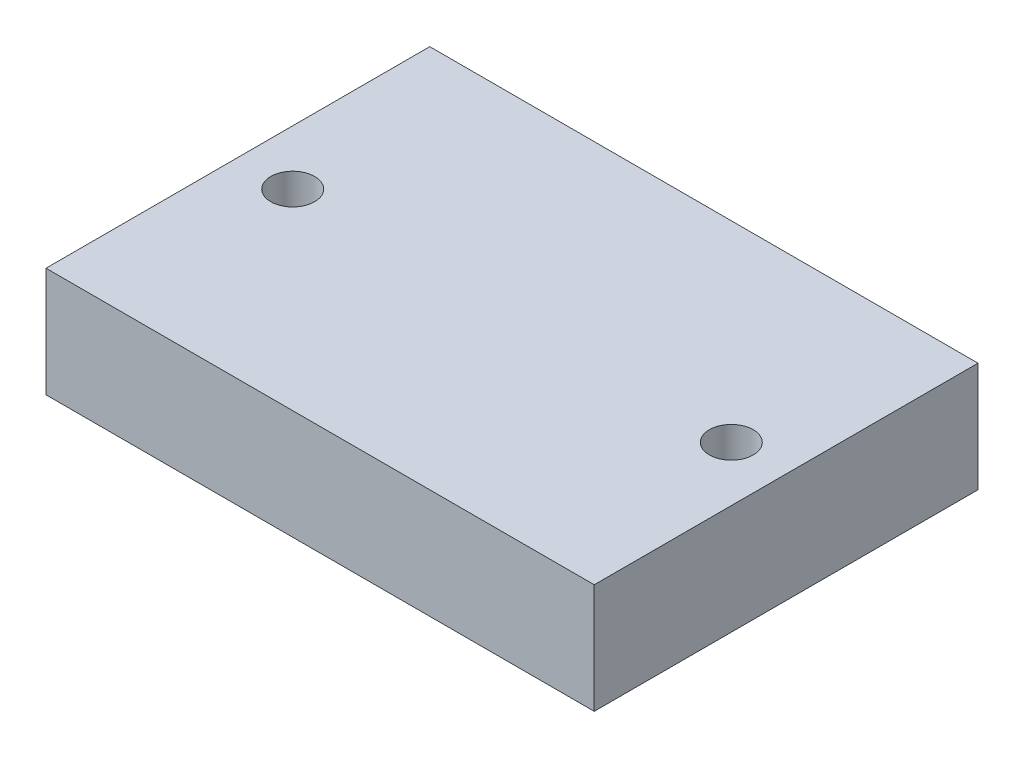
ISO-10303-21;
HEADER;
FILE_DESCRIPTION(('STEP AP214'),'2;1');
FILE_NAME('part.step','',(''),(''),'','','');
FILE_SCHEMA(('AUTOMOTIVE_DESIGN { 1 0 10303 214 1 1 1 1 }'));
ENDSEC;
DATA;
#1=APPLICATION_CONTEXT('core data for automotive mechanical design processes');
#2=APPLICATION_PROTOCOL_DEFINITION('international standard','automotive_design',2000,#1);
#3=PRODUCT_CONTEXT('',#1,'mechanical');
#4=PRODUCT('Part','Part','',(#3));
#5=PRODUCT_RELATED_PRODUCT_CATEGORY('part','',(#4));
#6=PRODUCT_DEFINITION_FORMATION('','',#4);
#7=PRODUCT_DEFINITION_CONTEXT('part definition',#1,'design');
#8=PRODUCT_DEFINITION('design','',#6,#7);
#9=PRODUCT_DEFINITION_SHAPE('','',#8);
#10=(LENGTH_UNIT() NAMED_UNIT(*) SI_UNIT(.MILLI.,.METRE.));
#11=(NAMED_UNIT(*) PLANE_ANGLE_UNIT() SI_UNIT($,.RADIAN.));
#12=(NAMED_UNIT(*) SI_UNIT($,.STERADIAN.) SOLID_ANGLE_UNIT());
#13=UNCERTAINTY_MEASURE_WITH_UNIT(LENGTH_MEASURE(1.E-05),#10,'distance_accuracy_value','');
#14=(GEOMETRIC_REPRESENTATION_CONTEXT(3) GLOBAL_UNCERTAINTY_ASSIGNED_CONTEXT((#13)) GLOBAL_UNIT_ASSIGNED_CONTEXT((#10,
#11,#12)) REPRESENTATION_CONTEXT('',''));
#15=CARTESIAN_POINT('',(0.,0.,0.));
#16=DIRECTION('',(0.,0.,1.));
#17=DIRECTION('',(1.,0.,0.));
#18=AXIS2_PLACEMENT_3D('',#15,#16,#17);
#19=CARTESIAN_POINT('',(25.,10.,-17.5));
#20=DIRECTION('',(-1.,0.,0.));
#21=DIRECTION('',(0.,0.,1.));
#22=AXIS2_PLACEMENT_3D('',#19,#20,#21);
#23=PLANE('',#22);
#24=DIRECTION('',(0.,0.,-1.));
#25=VECTOR('',#24,1.);
#26=CARTESIAN_POINT('',(25.,0.,-17.5));
#27=LINE('',#26,#25);
#28=CARTESIAN_POINT('',(25.,0.,17.5));
#29=VERTEX_POINT('',#28);
#30=CARTESIAN_POINT('',(25.,0.,-17.5));
#31=VERTEX_POINT('',#30);
#32=EDGE_CURVE('E102',#29,#31,#27,.T.);
#33=ORIENTED_EDGE('',*,*,#32,.T.);
#34=DIRECTION('',(0.,-1.,0.));
#35=VECTOR('',#34,1.);
#36=CARTESIAN_POINT('',(25.,10.,-17.5));
#37=LINE('',#36,#35);
#38=CARTESIAN_POINT('',(25.,10.,-17.5));
#39=VERTEX_POINT('',#38);
#40=EDGE_CURVE('E11',#39,#31,#37,.T.);
#41=ORIENTED_EDGE('',*,*,#40,.F.);
#42=DIRECTION('',(0.,0.,-1.));
#43=VECTOR('',#42,1.);
#44=CARTESIAN_POINT('',(25.,10.,-17.5));
#45=LINE('',#44,#43);
#46=CARTESIAN_POINT('',(25.,10.,17.5));
#47=VERTEX_POINT('',#46);
#48=EDGE_CURVE('E90',#47,#39,#45,.T.);
#49=ORIENTED_EDGE('',*,*,#48,.F.);
#50=DIRECTION('',(0.,-1.,0.));
#51=VECTOR('',#50,1.);
#52=CARTESIAN_POINT('',(25.,10.,17.5));
#53=LINE('',#52,#51);
#54=EDGE_CURVE('E98',#47,#29,#53,.T.);
#55=ORIENTED_EDGE('',*,*,#54,.T.);
#56=EDGE_LOOP('',(#33,#41,#49,#55));
#57=FACE_BOUND('',#56,.T.);
#58=ADVANCED_FACE('F39',(#57),#23,.F.);
#59=CARTESIAN_POINT('',(-25.,10.,-17.5));
#60=DIRECTION('',(0.,0.,1.));
#61=DIRECTION('',(1.,0.,0.));
#62=AXIS2_PLACEMENT_3D('',#59,#60,#61);
#63=PLANE('',#62);
#64=DIRECTION('',(-1.,0.,0.));
#65=VECTOR('',#64,1.);
#66=CARTESIAN_POINT('',(-25.,0.,-17.5));
#67=LINE('',#66,#65);
#68=CARTESIAN_POINT('',(-25.,0.,-17.5));
#69=VERTEX_POINT('',#68);
#70=EDGE_CURVE('E94',#31,#69,#67,.T.);
#71=ORIENTED_EDGE('',*,*,#70,.T.);
#72=DIRECTION('',(0.,-1.,0.));
#73=VECTOR('',#72,1.);
#74=CARTESIAN_POINT('',(-25.,10.,-17.5));
#75=LINE('',#74,#73);
#76=CARTESIAN_POINT('',(-25.,10.,-17.5));
#77=VERTEX_POINT('',#76);
#78=EDGE_CURVE('E47',#77,#69,#75,.T.);
#79=ORIENTED_EDGE('',*,*,#78,.F.);
#80=DIRECTION('',(-1.,0.,0.));
#81=VECTOR('',#80,1.);
#82=CARTESIAN_POINT('',(-25.,10.,-17.5));
#83=LINE('',#82,#81);
#84=EDGE_CURVE('E85',#39,#77,#83,.T.);
#85=ORIENTED_EDGE('',*,*,#84,.F.);
#86=ORIENTED_EDGE('',*,*,#40,.T.);
#87=EDGE_LOOP('',(#71,#79,#85,#86));
#88=FACE_BOUND('',#87,.T.);
#89=ADVANCED_FACE('F93',(#88),#63,.F.);
#90=CARTESIAN_POINT('',(-25.,10.,-17.5));
#91=DIRECTION('',(1.,0.,0.));
#92=DIRECTION('',(0.,0.,-1.));
#93=AXIS2_PLACEMENT_3D('',#90,#91,#92);
#94=PLANE('',#93);
#95=DIRECTION('',(0.,0.,1.));
#96=VECTOR('',#95,1.);
#97=CARTESIAN_POINT('',(-25.,0.,-17.5));
#98=LINE('',#97,#96);
#99=CARTESIAN_POINT('',(-25.,0.,17.5));
#100=VERTEX_POINT('',#99);
#101=EDGE_CURVE('E72',#69,#100,#98,.T.);
#102=ORIENTED_EDGE('',*,*,#101,.T.);
#103=DIRECTION('',(0.,-1.,0.));
#104=VECTOR('',#103,1.);
#105=CARTESIAN_POINT('',(-25.,10.,17.5));
#106=LINE('',#105,#104);
#107=CARTESIAN_POINT('',(-25.,10.,17.5));
#108=VERTEX_POINT('',#107);
#109=EDGE_CURVE('E95',#108,#100,#106,.T.);
#110=ORIENTED_EDGE('',*,*,#109,.F.);
#111=DIRECTION('',(0.,0.,1.));
#112=VECTOR('',#111,1.);
#113=CARTESIAN_POINT('',(-25.,10.,-17.5));
#114=LINE('',#113,#112);
#115=EDGE_CURVE('E88',#77,#108,#114,.T.);
#116=ORIENTED_EDGE('',*,*,#115,.F.);
#117=ORIENTED_EDGE('',*,*,#78,.T.);
#118=EDGE_LOOP('',(#102,#110,#116,#117));
#119=FACE_BOUND('',#118,.T.);
#120=ADVANCED_FACE('F96',(#119),#94,.F.);
#121=CARTESIAN_POINT('',(-25.,10.,17.5));
#122=DIRECTION('',(0.,0.,-1.));
#123=DIRECTION('',(-1.,0.,0.));
#124=AXIS2_PLACEMENT_3D('',#121,#122,#123);
#125=PLANE('',#124);
#126=DIRECTION('',(1.,0.,0.));
#127=VECTOR('',#126,1.);
#128=CARTESIAN_POINT('',(-25.,0.,17.5));
#129=LINE('',#128,#127);
#130=EDGE_CURVE('E78',#100,#29,#129,.T.);
#131=ORIENTED_EDGE('',*,*,#130,.T.);
#132=ORIENTED_EDGE('',*,*,#54,.F.);
#133=DIRECTION('',(1.,0.,0.));
#134=VECTOR('',#133,1.);
#135=CARTESIAN_POINT('',(-25.,10.,17.5));
#136=LINE('',#135,#134);
#137=EDGE_CURVE('E55',#108,#47,#136,.T.);
#138=ORIENTED_EDGE('',*,*,#137,.F.);
#139=ORIENTED_EDGE('',*,*,#109,.T.);
#140=EDGE_LOOP('',(#131,#132,#138,#139));
#141=FACE_BOUND('',#140,.T.);
#142=ADVANCED_FACE('F110',(#141),#125,.F.);
#143=CARTESIAN_POINT('',(0.,10.,0.));
#144=DIRECTION('',(0.,1.,0.));
#145=DIRECTION('',(0.,0.,1.));
#146=AXIS2_PLACEMENT_3D('',#143,#144,#145);
#147=PLANE('',#146);
#148=CARTESIAN_POINT('',(-20.,10.,0.));
#149=DIRECTION('',(0.,1.,0.));
#150=DIRECTION('',(0.,0.,1.));
#151=AXIS2_PLACEMENT_3D('',#148,#149,#150);
#152=CIRCLE('',#151,2.);
#153=CARTESIAN_POINT('',(-20.,10.,2.));
#154=VERTEX_POINT('',#153);
#155=EDGE_CURVE('E124',#154,#154,#152,.T.);
#156=ORIENTED_EDGE('',*,*,#155,.F.);
#157=EDGE_LOOP('',(#156));
#158=FACE_BOUND('',#157,.T.);
#159=CARTESIAN_POINT('',(20.,10.,0.));
#160=DIRECTION('',(0.,1.,0.));
#161=DIRECTION('',(0.,0.,1.));
#162=AXIS2_PLACEMENT_3D('',#159,#160,#161);
#163=CIRCLE('',#162,2.);
#164=CARTESIAN_POINT('',(20.,10.,2.));
#165=VERTEX_POINT('',#164);
#166=EDGE_CURVE('E118',#165,#165,#163,.T.);
#167=ORIENTED_EDGE('',*,*,#166,.F.);
#168=EDGE_LOOP('',(#167));
#169=FACE_BOUND('',#168,.T.);
#170=ORIENTED_EDGE('',*,*,#48,.T.);
#171=ORIENTED_EDGE('',*,*,#84,.T.);
#172=ORIENTED_EDGE('',*,*,#115,.T.);
#173=ORIENTED_EDGE('',*,*,#137,.T.);
#174=EDGE_LOOP('',(#170,#171,#172,#173));
#175=FACE_BOUND('',#174,.T.);
#176=ADVANCED_FACE('F86',(#158,#169,#175),#147,.T.);
#177=CARTESIAN_POINT('',(0.,0.,0.));
#178=DIRECTION('',(0.,1.,0.));
#179=DIRECTION('',(0.,0.,1.));
#180=AXIS2_PLACEMENT_3D('',#177,#178,#179);
#181=PLANE('',#180);
#182=CARTESIAN_POINT('',(-20.,0.,0.));
#183=DIRECTION('',(0.,1.,0.));
#184=DIRECTION('',(0.,0.,1.));
#185=AXIS2_PLACEMENT_3D('',#182,#183,#184);
#186=CIRCLE('',#185,2.);
#187=CARTESIAN_POINT('',(-20.,0.,2.));
#188=VERTEX_POINT('',#187);
#189=EDGE_CURVE('E121',#188,#188,#186,.T.);
#190=ORIENTED_EDGE('',*,*,#189,.T.);
#191=EDGE_LOOP('',(#190));
#192=FACE_BOUND('',#191,.T.);
#193=CARTESIAN_POINT('',(20.,0.,0.));
#194=DIRECTION('',(0.,1.,0.));
#195=DIRECTION('',(0.,0.,1.));
#196=AXIS2_PLACEMENT_3D('',#193,#194,#195);
#197=CIRCLE('',#196,2.);
#198=CARTESIAN_POINT('',(20.,0.,2.));
#199=VERTEX_POINT('',#198);
#200=EDGE_CURVE('E105',#199,#199,#197,.T.);
#201=ORIENTED_EDGE('',*,*,#200,.T.);
#202=EDGE_LOOP('',(#201));
#203=FACE_BOUND('',#202,.T.);
#204=ORIENTED_EDGE('',*,*,#32,.F.);
#205=ORIENTED_EDGE('',*,*,#130,.F.);
#206=ORIENTED_EDGE('',*,*,#101,.F.);
#207=ORIENTED_EDGE('',*,*,#70,.F.);
#208=EDGE_LOOP('',(#204,#205,#206,#207));
#209=FACE_BOUND('',#208,.T.);
#210=ADVANCED_FACE('F113',(#192,#203,#209),#181,.F.);
#211=CARTESIAN_POINT('',(20.,10.,0.));
#212=DIRECTION('',(0.,1.,0.));
#213=DIRECTION('',(0.,0.,1.));
#214=AXIS2_PLACEMENT_3D('',#211,#212,#213);
#215=CYLINDRICAL_SURFACE('',#214,2.);
#216=ORIENTED_EDGE('',*,*,#200,.F.);
#217=EDGE_LOOP('',(#216));
#218=FACE_BOUND('',#217,.T.);
#219=ORIENTED_EDGE('',*,*,#166,.T.);
#220=EDGE_LOOP('',(#219));
#221=FACE_BOUND('',#220,.T.);
#222=ADVANCED_FACE('F135',(#218,#221),#215,.F.);
#223=CARTESIAN_POINT('',(-20.,10.,0.));
#224=DIRECTION('',(0.,1.,0.));
#225=DIRECTION('',(0.,0.,1.));
#226=AXIS2_PLACEMENT_3D('',#223,#224,#225);
#227=CYLINDRICAL_SURFACE('',#226,2.);
#228=ORIENTED_EDGE('',*,*,#189,.F.);
#229=EDGE_LOOP('',(#228));
#230=FACE_BOUND('',#229,.T.);
#231=ORIENTED_EDGE('',*,*,#155,.T.);
#232=EDGE_LOOP('',(#231));
#233=FACE_BOUND('',#232,.T.);
#234=ADVANCED_FACE('F128',(#230,#233),#227,.F.);
#235=CLOSED_SHELL('',(#58,#89,#120,#142,#176,#210,#222,#234));
#236=MANIFOLD_SOLID_BREP('B2',#235);
#237=ADVANCED_BREP_SHAPE_REPRESENTATION('',(#18,#236),#14);
#238=SHAPE_DEFINITION_REPRESENTATION(#9,#237);
ENDSEC;
END-ISO-10303-21;
